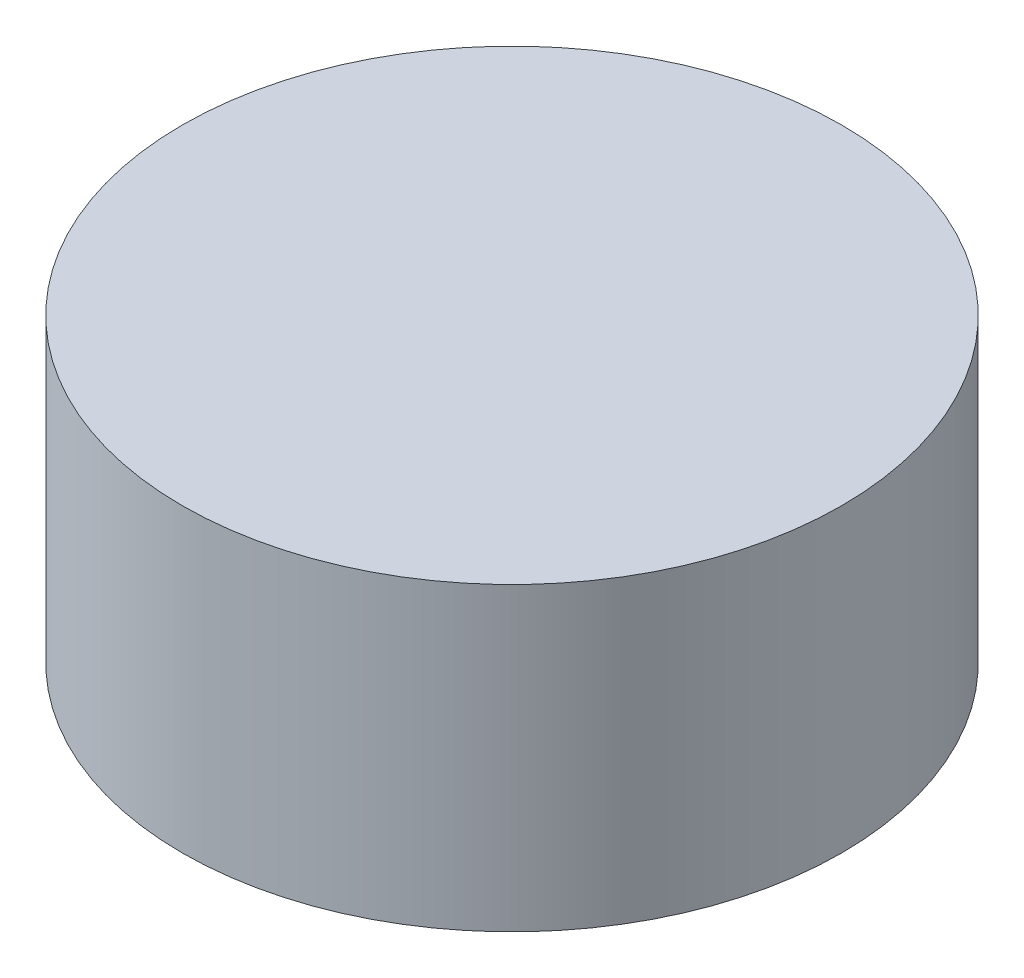
ISO-10303-21;
HEADER;
FILE_DESCRIPTION(('STEP AP214'),'2;1');
FILE_NAME('part.step','',(''),(''),'','','');
FILE_SCHEMA(('AUTOMOTIVE_DESIGN { 1 0 10303 214 1 1 1 1 }'));
ENDSEC;
DATA;
#1=APPLICATION_CONTEXT('core data for automotive mechanical design processes');
#2=APPLICATION_PROTOCOL_DEFINITION('international standard','automotive_design',2000,#1);
#3=PRODUCT_CONTEXT('',#1,'mechanical');
#4=PRODUCT('Part','Part','',(#3));
#5=PRODUCT_RELATED_PRODUCT_CATEGORY('part','',(#4));
#6=PRODUCT_DEFINITION_FORMATION('','',#4);
#7=PRODUCT_DEFINITION_CONTEXT('part definition',#1,'design');
#8=PRODUCT_DEFINITION('design','',#6,#7);
#9=PRODUCT_DEFINITION_SHAPE('','',#8);
#10=(LENGTH_UNIT() NAMED_UNIT(*) SI_UNIT(.MILLI.,.METRE.));
#11=(NAMED_UNIT(*) PLANE_ANGLE_UNIT() SI_UNIT($,.RADIAN.));
#12=(NAMED_UNIT(*) SI_UNIT($,.STERADIAN.) SOLID_ANGLE_UNIT());
#13=UNCERTAINTY_MEASURE_WITH_UNIT(LENGTH_MEASURE(1.E-05),#10,'distance_accuracy_value','');
#14=(GEOMETRIC_REPRESENTATION_CONTEXT(3) GLOBAL_UNCERTAINTY_ASSIGNED_CONTEXT((#13)) GLOBAL_UNIT_ASSIGNED_CONTEXT((#10,
#11,#12)) REPRESENTATION_CONTEXT('',''));
#15=CARTESIAN_POINT('',(0.,0.,0.));
#16=DIRECTION('',(0.,0.,1.));
#17=DIRECTION('',(1.,0.,0.));
#18=AXIS2_PLACEMENT_3D('',#15,#16,#17);
#19=CARTESIAN_POINT('',(0.,50.,0.));
#20=DIRECTION('',(0.,-1.,0.));
#21=DIRECTION('',(0.,0.,-1.));
#22=AXIS2_PLACEMENT_3D('',#19,#20,#21);
#23=CYLINDRICAL_SURFACE('',#22,57.);
#24=CARTESIAN_POINT('',(0.,52.,0.));
#25=DIRECTION('',(0.,1.,0.));
#26=DIRECTION('',(0.,0.,1.));
#27=AXIS2_PLACEMENT_3D('',#24,#25,#26);
#28=CIRCLE('',#27,57.);
#29=CARTESIAN_POINT('',(0.,52.,57.));
#30=VERTEX_POINT('',#29);
#31=EDGE_CURVE('E10',#30,#30,#28,.T.);
#32=ORIENTED_EDGE('',*,*,#31,.F.);
#33=EDGE_LOOP('',(#32));
#34=FACE_BOUND('',#33,.T.);
#35=CARTESIAN_POINT('',(0.,0.,0.));
#36=DIRECTION('',(0.,1.,0.));
#37=DIRECTION('',(0.,0.,1.));
#38=AXIS2_PLACEMENT_3D('',#35,#36,#37);
#39=CIRCLE('',#38,57.);
#40=CARTESIAN_POINT('',(0.,0.,57.));
#41=VERTEX_POINT('',#40);
#42=EDGE_CURVE('E45',#41,#41,#39,.T.);
#43=ORIENTED_EDGE('',*,*,#42,.T.);
#44=EDGE_LOOP('',(#43));
#45=FACE_BOUND('',#44,.T.);
#46=ADVANCED_FACE('F41',(#34,#45),#23,.T.);
#47=CARTESIAN_POINT('',(0.,52.,0.));
#48=DIRECTION('',(0.,1.,0.));
#49=DIRECTION('',(0.,0.,1.));
#50=AXIS2_PLACEMENT_3D('',#47,#48,#49);
#51=PLANE('',#50);
#52=ORIENTED_EDGE('',*,*,#31,.T.);
#53=EDGE_LOOP('',(#52));
#54=FACE_BOUND('',#53,.T.);
#55=ADVANCED_FACE('F43',(#54),#51,.T.);
#56=CARTESIAN_POINT('',(0.,0.,0.));
#57=DIRECTION('',(0.,1.,0.));
#58=DIRECTION('',(0.,0.,1.));
#59=AXIS2_PLACEMENT_3D('',#56,#57,#58);
#60=PLANE('',#59);
#61=CARTESIAN_POINT('',(0.,0.,0.));
#62=DIRECTION('',(0.,1.,0.));
#63=DIRECTION('',(0.,0.,1.));
#64=AXIS2_PLACEMENT_3D('',#61,#62,#63);
#65=CIRCLE('',#64,55.);
#66=CARTESIAN_POINT('',(0.,0.,55.));
#67=VERTEX_POINT('',#66);
#68=EDGE_CURVE('E56',#67,#67,#65,.T.);
#69=ORIENTED_EDGE('',*,*,#68,.T.);
#70=EDGE_LOOP('',(#69));
#71=FACE_BOUND('',#70,.T.);
#72=ORIENTED_EDGE('',*,*,#42,.F.);
#73=EDGE_LOOP('',(#72));
#74=FACE_BOUND('',#73,.T.);
#75=ADVANCED_FACE('F73',(#71,#74),#60,.F.);
#76=CARTESIAN_POINT('',(0.,50.,0.));
#77=DIRECTION('',(0.,-1.,0.));
#78=DIRECTION('',(0.,0.,-1.));
#79=AXIS2_PLACEMENT_3D('',#76,#77,#78);
#80=CYLINDRICAL_SURFACE('',#79,55.);
#81=CARTESIAN_POINT('',(0.,50.,0.));
#82=DIRECTION('',(0.,1.,0.));
#83=DIRECTION('',(0.,0.,1.));
#84=AXIS2_PLACEMENT_3D('',#81,#82,#83);
#85=CIRCLE('',#84,55.);
#86=CARTESIAN_POINT('',(0.,50.,55.));
#87=VERTEX_POINT('',#86);
#88=EDGE_CURVE('E54',#87,#87,#85,.T.);
#89=ORIENTED_EDGE('',*,*,#88,.T.);
#90=EDGE_LOOP('',(#89));
#91=FACE_BOUND('',#90,.T.);
#92=ORIENTED_EDGE('',*,*,#68,.F.);
#93=EDGE_LOOP('',(#92));
#94=FACE_BOUND('',#93,.T.);
#95=ADVANCED_FACE('F64',(#91,#94),#80,.F.);
#96=CARTESIAN_POINT('',(0.,50.,0.));
#97=DIRECTION('',(0.,1.,0.));
#98=DIRECTION('',(0.,0.,1.));
#99=AXIS2_PLACEMENT_3D('',#96,#97,#98);
#100=PLANE('',#99);
#101=ORIENTED_EDGE('',*,*,#88,.F.);
#102=EDGE_LOOP('',(#101));
#103=FACE_BOUND('',#102,.T.);
#104=ADVANCED_FACE('F67',(#103),#100,.F.);
#105=CLOSED_SHELL('',(#46,#55,#75,#95,#104));
#106=MANIFOLD_SOLID_BREP('B2',#105);
#107=ADVANCED_BREP_SHAPE_REPRESENTATION('',(#18,#106),#14);
#108=SHAPE_DEFINITION_REPRESENTATION(#9,#107);
ENDSEC;
END-ISO-10303-21;
